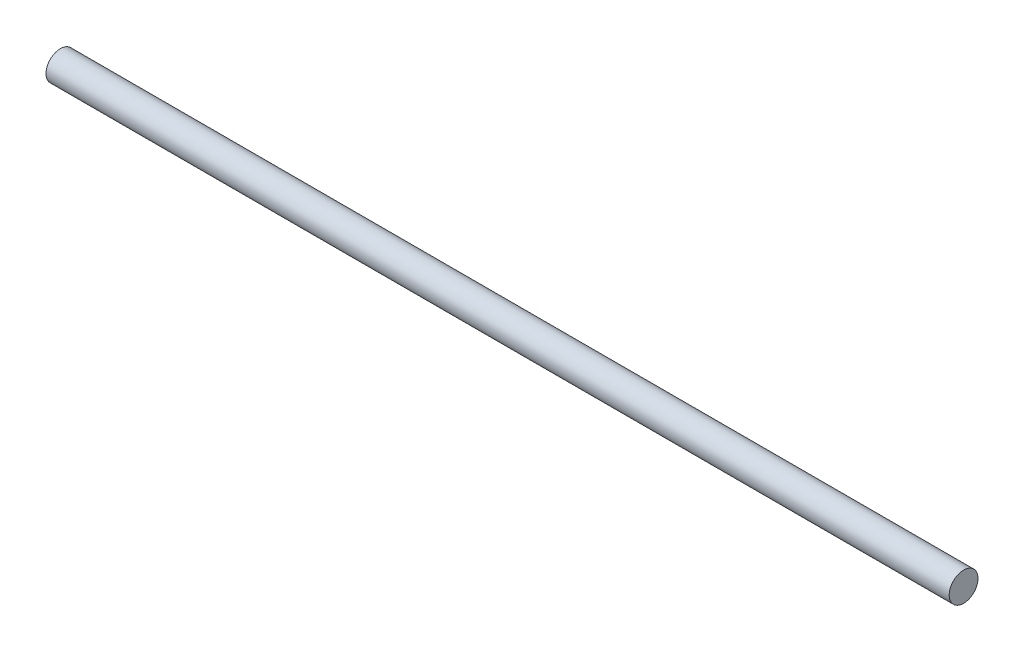
ISO-10303-21;
HEADER;
FILE_DESCRIPTION(('STEP AP214'),'2;1');
FILE_NAME('part.step','',(''),(''),'','','');
FILE_SCHEMA(('AUTOMOTIVE_DESIGN { 1 0 10303 214 1 1 1 1 }'));
ENDSEC;
DATA;
#1=APPLICATION_CONTEXT('core data for automotive mechanical design processes');
#2=APPLICATION_PROTOCOL_DEFINITION('international standard','automotive_design',2000,#1);
#3=PRODUCT_CONTEXT('',#1,'mechanical');
#4=PRODUCT('Part','Part','',(#3));
#5=PRODUCT_RELATED_PRODUCT_CATEGORY('part','',(#4));
#6=PRODUCT_DEFINITION_FORMATION('','',#4);
#7=PRODUCT_DEFINITION_CONTEXT('part definition',#1,'design');
#8=PRODUCT_DEFINITION('design','',#6,#7);
#9=PRODUCT_DEFINITION_SHAPE('','',#8);
#10=(LENGTH_UNIT() NAMED_UNIT(*) SI_UNIT(.MILLI.,.METRE.));
#11=(NAMED_UNIT(*) PLANE_ANGLE_UNIT() SI_UNIT($,.RADIAN.));
#12=(NAMED_UNIT(*) SI_UNIT($,.STERADIAN.) SOLID_ANGLE_UNIT());
#13=UNCERTAINTY_MEASURE_WITH_UNIT(LENGTH_MEASURE(1.E-05),#10,'distance_accuracy_value','');
#14=(GEOMETRIC_REPRESENTATION_CONTEXT(3) GLOBAL_UNCERTAINTY_ASSIGNED_CONTEXT((#13)) GLOBAL_UNIT_ASSIGNED_CONTEXT((#10,
#11,#12)) REPRESENTATION_CONTEXT('',''));
#15=CARTESIAN_POINT('',(0.,0.,0.));
#16=DIRECTION('',(0.,0.,1.));
#17=DIRECTION('',(1.,0.,0.));
#18=AXIS2_PLACEMENT_3D('',#15,#16,#17);
#19=CARTESIAN_POINT('',(0.,0.,0.));
#20=DIRECTION('',(1.,0.,0.));
#21=DIRECTION('',(0.,0.,-1.));
#22=AXIS2_PLACEMENT_3D('',#19,#20,#21);
#23=PLANE('',#22);
#24=CARTESIAN_POINT('',(0.,0.,0.));
#25=DIRECTION('',(-1.,0.,0.));
#26=DIRECTION('',(0.,0.,1.));
#27=AXIS2_PLACEMENT_3D('',#24,#25,#26);
#28=CIRCLE('',#27,6.5);
#29=CARTESIAN_POINT('',(0.,0.,6.5));
#30=VERTEX_POINT('',#29);
#31=EDGE_CURVE('E10',#30,#30,#28,.T.);
#32=ORIENTED_EDGE('',*,*,#31,.T.);
#33=EDGE_LOOP('',(#32));
#34=FACE_BOUND('',#33,.T.);
#35=ADVANCED_FACE('F43',(#34),#23,.F.);
#36=CARTESIAN_POINT('',(0.,0.,0.));
#37=DIRECTION('',(-1.,0.,0.));
#38=DIRECTION('',(0.,0.,1.));
#39=AXIS2_PLACEMENT_3D('',#36,#37,#38);
#40=CYLINDRICAL_SURFACE('',#39,6.5);
#41=ORIENTED_EDGE('',*,*,#31,.F.);
#42=EDGE_LOOP('',(#41));
#43=FACE_BOUND('',#42,.T.);
#44=CARTESIAN_POINT('',(407.,0.,0.));
#45=DIRECTION('',(-1.,0.,0.));
#46=DIRECTION('',(0.,0.,1.));
#47=AXIS2_PLACEMENT_3D('',#44,#45,#46);
#48=CIRCLE('',#47,6.5);
#49=CARTESIAN_POINT('',(407.,0.,6.5));
#50=VERTEX_POINT('',#49);
#51=EDGE_CURVE('E50',#50,#50,#48,.T.);
#52=ORIENTED_EDGE('',*,*,#51,.T.);
#53=EDGE_LOOP('',(#52));
#54=FACE_BOUND('',#53,.T.);
#55=ADVANCED_FACE('F57',(#43,#54),#40,.T.);
#56=CARTESIAN_POINT('',(407.,0.,-6.5));
#57=DIRECTION('',(-1.,0.,0.));
#58=DIRECTION('',(0.,0.,1.));
#59=AXIS2_PLACEMENT_3D('',#56,#57,#58);
#60=PLANE('',#59);
#61=ORIENTED_EDGE('',*,*,#51,.F.);
#62=EDGE_LOOP('',(#61));
#63=FACE_BOUND('',#62,.T.);
#64=ADVANCED_FACE('F59',(#63),#60,.F.);
#65=CLOSED_SHELL('',(#35,#55,#64));
#66=MANIFOLD_SOLID_BREP('B2',#65);
#67=ADVANCED_BREP_SHAPE_REPRESENTATION('',(#18,#66),#14);
#68=SHAPE_DEFINITION_REPRESENTATION(#9,#67);
ENDSEC;
END-ISO-10303-21;
